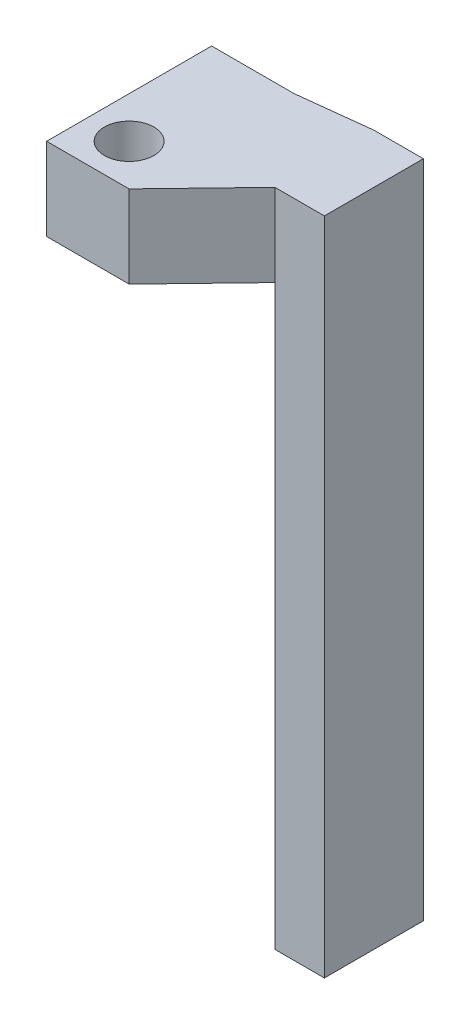
ISO-10303-21;
HEADER;
FILE_DESCRIPTION(('STEP AP214'),'2;1');
FILE_NAME('part.step','',(''),(''),'','','');
FILE_SCHEMA(('AUTOMOTIVE_DESIGN { 1 0 10303 214 1 1 1 1 }'));
ENDSEC;
DATA;
#1=APPLICATION_CONTEXT('core data for automotive mechanical design processes');
#2=APPLICATION_PROTOCOL_DEFINITION('international standard','automotive_design',2000,#1);
#3=PRODUCT_CONTEXT('',#1,'mechanical');
#4=PRODUCT('Part','Part','',(#3));
#5=PRODUCT_RELATED_PRODUCT_CATEGORY('part','',(#4));
#6=PRODUCT_DEFINITION_FORMATION('','',#4);
#7=PRODUCT_DEFINITION_CONTEXT('part definition',#1,'design');
#8=PRODUCT_DEFINITION('design','',#6,#7);
#9=PRODUCT_DEFINITION_SHAPE('','',#8);
#10=(LENGTH_UNIT() NAMED_UNIT(*) SI_UNIT(.MILLI.,.METRE.));
#11=(NAMED_UNIT(*) PLANE_ANGLE_UNIT() SI_UNIT($,.RADIAN.));
#12=(NAMED_UNIT(*) SI_UNIT($,.STERADIAN.) SOLID_ANGLE_UNIT());
#13=UNCERTAINTY_MEASURE_WITH_UNIT(LENGTH_MEASURE(1.E-05),#10,'distance_accuracy_value','');
#14=(GEOMETRIC_REPRESENTATION_CONTEXT(3) GLOBAL_UNCERTAINTY_ASSIGNED_CONTEXT((#13)) GLOBAL_UNIT_ASSIGNED_CONTEXT((#10,
#11,#12)) REPRESENTATION_CONTEXT('',''));
#15=CARTESIAN_POINT('',(0.,0.,0.));
#16=DIRECTION('',(0.,0.,1.));
#17=DIRECTION('',(1.,0.,0.));
#18=AXIS2_PLACEMENT_3D('',#15,#16,#17);
#19=CARTESIAN_POINT('',(0.,-20.,0.));
#20=DIRECTION('',(-1.,0.,0.));
#21=DIRECTION('',(0.,0.,1.));
#22=AXIS2_PLACEMENT_3D('',#19,#20,#21);
#23=PLANE('',#22);
#24=DIRECTION('',(0.,1.,0.));
#25=VECTOR('',#24,1.);
#26=CARTESIAN_POINT('',(0.,-20.,0.));
#27=LINE('',#26,#25);
#28=CARTESIAN_POINT('',(0.,-20.,0.));
#29=VERTEX_POINT('',#28);
#30=CARTESIAN_POINT('',(0.,15.,0.));
#31=VERTEX_POINT('',#30);
#32=EDGE_CURVE('E360',#29,#31,#27,.T.);
#33=ORIENTED_EDGE('',*,*,#32,.T.);
#34=DIRECTION('',(0.,0.,1.));
#35=VECTOR('',#34,1.);
#36=CARTESIAN_POINT('',(0.,15.,-6.));
#37=LINE('',#36,#35);
#38=CARTESIAN_POINT('',(0.,15.,-6.));
#39=VERTEX_POINT('',#38);
#40=EDGE_CURVE('E308',#39,#31,#37,.T.);
#41=ORIENTED_EDGE('',*,*,#40,.F.);
#42=DIRECTION('',(0.,1.,0.));
#43=VECTOR('',#42,1.);
#44=CARTESIAN_POINT('',(0.,-20.,-6.));
#45=LINE('',#44,#43);
#46=CARTESIAN_POINT('',(0.,-20.,-6.));
#47=VERTEX_POINT('',#46);
#48=EDGE_CURVE('E13',#47,#39,#45,.T.);
#49=ORIENTED_EDGE('',*,*,#48,.F.);
#50=DIRECTION('',(0.,0.,1.));
#51=VECTOR('',#50,1.);
#52=CARTESIAN_POINT('',(0.,-20.,0.));
#53=LINE('',#52,#51);
#54=EDGE_CURVE('E305',#47,#29,#53,.T.);
#55=ORIENTED_EDGE('',*,*,#54,.T.);
#56=EDGE_LOOP('',(#33,#41,#49,#55));
#57=FACE_BOUND('',#56,.T.);
#58=ADVANCED_FACE('F91',(#57),#23,.T.);
#59=CARTESIAN_POINT('',(0.,-20.,-6.));
#60=DIRECTION('',(0.,0.,-1.));
#61=DIRECTION('',(-1.,0.,0.));
#62=AXIS2_PLACEMENT_3D('',#59,#60,#61);
#63=PLANE('',#62);
#64=ORIENTED_EDGE('',*,*,#48,.T.);
#65=DIRECTION('',(0.,-1.,0.));
#66=VECTOR('',#65,1.);
#67=CARTESIAN_POINT('',(0.,20.,-6.));
#68=LINE('',#67,#66);
#69=CARTESIAN_POINT('',(0.,20.,-6.));
#70=VERTEX_POINT('',#69);
#71=EDGE_CURVE('E198',#70,#39,#68,.T.);
#72=ORIENTED_EDGE('',*,*,#71,.F.);
#73=DIRECTION('',(-1.,0.,0.));
#74=VECTOR('',#73,1.);
#75=CARTESIAN_POINT('',(0.,20.,-6.));
#76=LINE('',#75,#74);
#77=CARTESIAN_POINT('',(3.,20.,-6.));
#78=VERTEX_POINT('',#77);
#79=EDGE_CURVE('E297',#78,#70,#76,.T.);
#80=ORIENTED_EDGE('',*,*,#79,.F.);
#81=DIRECTION('',(0.,1.,0.));
#82=VECTOR('',#81,1.);
#83=CARTESIAN_POINT('',(3.,-20.,-6.));
#84=LINE('',#83,#82);
#85=CARTESIAN_POINT('',(3.,-20.,-6.));
#86=VERTEX_POINT('',#85);
#87=EDGE_CURVE('E99',#86,#78,#84,.T.);
#88=ORIENTED_EDGE('',*,*,#87,.F.);
#89=DIRECTION('',(-1.,0.,0.));
#90=VECTOR('',#89,1.);
#91=CARTESIAN_POINT('',(0.,-20.,-6.));
#92=LINE('',#91,#90);
#93=EDGE_CURVE('E358',#86,#47,#92,.T.);
#94=ORIENTED_EDGE('',*,*,#93,.T.);
#95=EDGE_LOOP('',(#64,#72,#80,#88,#94));
#96=FACE_BOUND('',#95,.T.);
#97=ADVANCED_FACE('F376',(#96),#63,.T.);
#98=CARTESIAN_POINT('',(3.,-20.,0.));
#99=DIRECTION('',(1.,0.,0.));
#100=DIRECTION('',(0.,0.,-1.));
#101=AXIS2_PLACEMENT_3D('',#98,#99,#100);
#102=PLANE('',#101);
#103=ORIENTED_EDGE('',*,*,#87,.T.);
#104=DIRECTION('',(0.,0.,-1.));
#105=VECTOR('',#104,1.);
#106=CARTESIAN_POINT('',(3.,20.,0.));
#107=LINE('',#106,#105);
#108=CARTESIAN_POINT('',(3.,20.,0.));
#109=VERTEX_POINT('',#108);
#110=EDGE_CURVE('E295',#109,#78,#107,.T.);
#111=ORIENTED_EDGE('',*,*,#110,.F.);
#112=DIRECTION('',(0.,1.,0.));
#113=VECTOR('',#112,1.);
#114=CARTESIAN_POINT('',(3.,-20.,0.));
#115=LINE('',#114,#113);
#116=CARTESIAN_POINT('',(3.,-20.,0.));
#117=VERTEX_POINT('',#116);
#118=EDGE_CURVE('E294',#117,#109,#115,.T.);
#119=ORIENTED_EDGE('',*,*,#118,.F.);
#120=DIRECTION('',(0.,0.,-1.));
#121=VECTOR('',#120,1.);
#122=CARTESIAN_POINT('',(3.,-20.,0.));
#123=LINE('',#122,#121);
#124=EDGE_CURVE('E355',#117,#86,#123,.T.);
#125=ORIENTED_EDGE('',*,*,#124,.T.);
#126=EDGE_LOOP('',(#103,#111,#119,#125));
#127=FACE_BOUND('',#126,.T.);
#128=ADVANCED_FACE('F372',(#127),#102,.T.);
#129=CARTESIAN_POINT('',(0.,-20.,0.));
#130=DIRECTION('',(0.,0.,1.));
#131=DIRECTION('',(1.,0.,0.));
#132=AXIS2_PLACEMENT_3D('',#129,#130,#131);
#133=PLANE('',#132);
#134=ORIENTED_EDGE('',*,*,#118,.T.);
#135=DIRECTION('',(1.,0.,0.));
#136=VECTOR('',#135,1.);
#137=CARTESIAN_POINT('',(0.,20.,0.));
#138=LINE('',#137,#136);
#139=CARTESIAN_POINT('',(0.,20.,0.));
#140=VERTEX_POINT('',#139);
#141=EDGE_CURVE('E244',#140,#109,#138,.T.);
#142=ORIENTED_EDGE('',*,*,#141,.F.);
#143=DIRECTION('',(0.,1.,0.));
#144=VECTOR('',#143,1.);
#145=CARTESIAN_POINT('',(0.,20.,0.));
#146=LINE('',#145,#144);
#147=EDGE_CURVE('E212',#31,#140,#146,.T.);
#148=ORIENTED_EDGE('',*,*,#147,.F.);
#149=ORIENTED_EDGE('',*,*,#32,.F.);
#150=DIRECTION('',(1.,0.,0.));
#151=VECTOR('',#150,1.);
#152=CARTESIAN_POINT('',(0.,-20.,0.));
#153=LINE('',#152,#151);
#154=EDGE_CURVE('E353',#29,#117,#153,.T.);
#155=ORIENTED_EDGE('',*,*,#154,.T.);
#156=EDGE_LOOP('',(#134,#142,#148,#149,#155));
#157=FACE_BOUND('',#156,.T.);
#158=ADVANCED_FACE('F291',(#157),#133,.T.);
#159=CARTESIAN_POINT('',(0.,-20.,0.));
#160=DIRECTION('',(0.,-1.,0.));
#161=DIRECTION('',(0.,0.,-1.));
#162=AXIS2_PLACEMENT_3D('',#159,#160,#161);
#163=PLANE('',#162);
#164=ORIENTED_EDGE('',*,*,#54,.F.);
#165=ORIENTED_EDGE('',*,*,#93,.F.);
#166=ORIENTED_EDGE('',*,*,#124,.F.);
#167=ORIENTED_EDGE('',*,*,#154,.F.);
#168=EDGE_LOOP('',(#164,#165,#166,#167));
#169=FACE_BOUND('',#168,.T.);
#170=ADVANCED_FACE('F369',(#169),#163,.T.);
#171=CARTESIAN_POINT('',(0.,20.,0.));
#172=DIRECTION('',(0.,-1.,0.));
#173=DIRECTION('',(0.,0.,-1.));
#174=AXIS2_PLACEMENT_3D('',#171,#172,#173);
#175=PLANE('',#174);
#176=ORIENTED_EDGE('',*,*,#79,.T.);
#177=CARTESIAN_POINT('',(0.,20.,-6.));
#178=CARTESIAN_POINT('',(-1.44444444444444,20.,-5.83333333333333));
#179=CARTESIAN_POINT('',(-2.88888888888888,20.,-5.66666666666667));
#180=CARTESIAN_POINT('',(-4.33333333333333,20.,-5.5));
#181=B_SPLINE_CURVE_WITH_KNOTS('',3,(#177,#178,#179,#180),.UNSPECIFIED.,.F.,.F.,(4,4),(0.,1.),.UNSPECIFIED.);
#182=CARTESIAN_POINT('',(-4.33333333333333,20.,-5.5));
#183=VERTEX_POINT('',#182);
#184=EDGE_CURVE('E185',#70,#183,#181,.T.);
#185=ORIENTED_EDGE('',*,*,#184,.T.);
#186=DIRECTION('',(1.,0.,0.));
#187=VECTOR('',#186,1.);
#188=CARTESIAN_POINT('',(-9.33333333333333,20.,-5.5));
#189=LINE('',#188,#187);
#190=CARTESIAN_POINT('',(-9.33333333333333,20.,-5.5));
#191=VERTEX_POINT('',#190);
#192=EDGE_CURVE('E167',#191,#183,#189,.T.);
#193=ORIENTED_EDGE('',*,*,#192,.F.);
#194=DIRECTION('',(0.,0.,-1.));
#195=VECTOR('',#194,1.);
#196=CARTESIAN_POINT('',(-9.33333333333333,20.,-5.5));
#197=LINE('',#196,#195);
#198=CARTESIAN_POINT('',(-9.33333333333332,20.,4.5));
#199=VERTEX_POINT('',#198);
#200=EDGE_CURVE('E183',#199,#191,#197,.T.);
#201=ORIENTED_EDGE('',*,*,#200,.F.);
#202=DIRECTION('',(-1.,0.,0.));
#203=VECTOR('',#202,1.);
#204=CARTESIAN_POINT('',(-9.33333333333332,20.,4.5));
#205=LINE('',#204,#203);
#206=CARTESIAN_POINT('',(-4.33333333333333,20.,4.5));
#207=VERTEX_POINT('',#206);
#208=EDGE_CURVE('E174',#207,#199,#205,.T.);
#209=ORIENTED_EDGE('',*,*,#208,.F.);
#210=CARTESIAN_POINT('',(0.,20.,0.));
#211=CARTESIAN_POINT('',(-1.44444444444444,20.,1.5));
#212=CARTESIAN_POINT('',(-2.88888888888889,20.,3.));
#213=CARTESIAN_POINT('',(-4.33333333333333,20.,4.5));
#214=B_SPLINE_CURVE_WITH_KNOTS('',3,(#210,#211,#212,#213),.UNSPECIFIED.,.F.,.F.,(4,4),(0.,1.),.UNSPECIFIED.);
#215=EDGE_CURVE('E200',#140,#207,#214,.T.);
#216=ORIENTED_EDGE('',*,*,#215,.F.);
#217=ORIENTED_EDGE('',*,*,#141,.T.);
#218=ORIENTED_EDGE('',*,*,#110,.T.);
#219=EDGE_LOOP('',(#176,#185,#193,#201,#209,#216,#217,#218));
#220=FACE_BOUND('',#219,.T.);
#221=CARTESIAN_POINT('',(-6.83333333333333,20.,2.));
#222=DIRECTION('',(0.,-1.,0.));
#223=DIRECTION('',(0.,0.,-1.));
#224=AXIS2_PLACEMENT_3D('',#221,#222,#223);
#225=CIRCLE('',#224,1.5);
#226=CARTESIAN_POINT('',(-6.83333333333333,20.,0.499999999999999));
#227=VERTEX_POINT('',#226);
#228=EDGE_CURVE('E197',#227,#227,#225,.T.);
#229=ORIENTED_EDGE('',*,*,#228,.T.);
#230=EDGE_LOOP('',(#229));
#231=FACE_BOUND('',#230,.T.);
#232=ADVANCED_FACE('F180',(#220,#231),#175,.F.);
#233=CARTESIAN_POINT('',(0.,15.,0.));
#234=DIRECTION('',(0.720320213491481,0.,0.69364168706587));
#235=DIRECTION('',(0.,1.,0.));
#236=AXIS2_PLACEMENT_3D('',#233,#234,#235);
#237=PLANE('',#236);
#238=ORIENTED_EDGE('',*,*,#147,.T.);
#239=ORIENTED_EDGE('',*,*,#215,.T.);
#240=DIRECTION('',(0.,-1.,0.));
#241=VECTOR('',#240,1.);
#242=CARTESIAN_POINT('',(-4.33333333333333,20.,4.5));
#243=LINE('',#242,#241);
#244=CARTESIAN_POINT('',(-4.33333333333333,15.,4.5));
#245=VERTEX_POINT('',#244);
#246=EDGE_CURVE('E241',#207,#245,#243,.T.);
#247=ORIENTED_EDGE('',*,*,#246,.T.);
#248=CARTESIAN_POINT('',(0.,15.,0.));
#249=CARTESIAN_POINT('',(-1.44444444444444,15.,1.5));
#250=CARTESIAN_POINT('',(-2.88888888888889,15.,3.));
#251=CARTESIAN_POINT('',(-4.33333333333333,15.,4.5));
#252=B_SPLINE_CURVE_WITH_KNOTS('',3,(#248,#249,#250,#251),.UNSPECIFIED.,.F.,.F.,(4,4),(0.,1.),.UNSPECIFIED.);
#253=EDGE_CURVE('E203',#31,#245,#252,.T.);
#254=ORIENTED_EDGE('',*,*,#253,.F.);
#255=EDGE_LOOP('',(#238,#239,#247,#254));
#256=FACE_BOUND('',#255,.T.);
#257=ADVANCED_FACE('F322',(#256),#237,.T.);
#258=CARTESIAN_POINT('',(0.,15.,-6.));
#259=DIRECTION('',(0.,-1.,0.));
#260=DIRECTION('',(0.,0.,1.));
#261=AXIS2_PLACEMENT_3D('',#258,#259,#260);
#262=PLANE('',#261);
#263=ORIENTED_EDGE('',*,*,#40,.T.);
#264=ORIENTED_EDGE('',*,*,#253,.T.);
#265=DIRECTION('',(-1.,0.,0.));
#266=VECTOR('',#265,1.);
#267=CARTESIAN_POINT('',(-9.33333333333332,15.,4.5));
#268=LINE('',#267,#266);
#269=CARTESIAN_POINT('',(-9.33333333333332,15.,4.5));
#270=VERTEX_POINT('',#269);
#271=EDGE_CURVE('E188',#245,#270,#268,.T.);
#272=ORIENTED_EDGE('',*,*,#271,.T.);
#273=DIRECTION('',(0.,0.,-1.));
#274=VECTOR('',#273,1.);
#275=CARTESIAN_POINT('',(-9.33333333333333,15.,-5.5));
#276=LINE('',#275,#274);
#277=CARTESIAN_POINT('',(-9.33333333333333,15.,-5.5));
#278=VERTEX_POINT('',#277);
#279=EDGE_CURVE('E195',#270,#278,#276,.T.);
#280=ORIENTED_EDGE('',*,*,#279,.T.);
#281=DIRECTION('',(1.,0.,0.));
#282=VECTOR('',#281,1.);
#283=CARTESIAN_POINT('',(-9.33333333333333,15.,-5.5));
#284=LINE('',#283,#282);
#285=CARTESIAN_POINT('',(-4.33333333333333,15.,-5.5));
#286=VERTEX_POINT('',#285);
#287=EDGE_CURVE('E168',#278,#286,#284,.T.);
#288=ORIENTED_EDGE('',*,*,#287,.T.);
#289=CARTESIAN_POINT('',(0.,15.,-6.));
#290=CARTESIAN_POINT('',(-1.44444444444444,15.,-5.83333333333333));
#291=CARTESIAN_POINT('',(-2.88888888888888,15.,-5.66666666666667));
#292=CARTESIAN_POINT('',(-4.33333333333333,15.,-5.5));
#293=B_SPLINE_CURVE_WITH_KNOTS('',3,(#289,#290,#291,#292),.UNSPECIFIED.,.F.,.F.,(4,4),(0.,1.),.UNSPECIFIED.);
#294=EDGE_CURVE('E107',#39,#286,#293,.T.);
#295=ORIENTED_EDGE('',*,*,#294,.F.);
#296=EDGE_LOOP('',(#263,#264,#272,#280,#288,#295));
#297=FACE_BOUND('',#296,.T.);
#298=CARTESIAN_POINT('',(-6.83333333333333,15.,2.));
#299=DIRECTION('',(0.,-1.,0.));
#300=DIRECTION('',(0.,0.,-1.));
#301=AXIS2_PLACEMENT_3D('',#298,#299,#300);
#302=CIRCLE('',#301,1.5);
#303=CARTESIAN_POINT('',(-6.83333333333333,15.,0.499999999999999));
#304=VERTEX_POINT('',#303);
#305=EDGE_CURVE('E193',#304,#304,#302,.T.);
#306=ORIENTED_EDGE('',*,*,#305,.F.);
#307=EDGE_LOOP('',(#306));
#308=FACE_BOUND('',#307,.T.);
#309=ADVANCED_FACE('F319',(#297,#308),#262,.T.);
#310=CARTESIAN_POINT('',(0.,20.,-6.));
#311=DIRECTION('',(-0.114624107985131,0.,-0.993408935871131));
#312=DIRECTION('',(0.,-1.,0.));
#313=AXIS2_PLACEMENT_3D('',#310,#311,#312);
#314=PLANE('',#313);
#315=ORIENTED_EDGE('',*,*,#71,.T.);
#316=ORIENTED_EDGE('',*,*,#294,.T.);
#317=DIRECTION('',(0.,-1.,0.));
#318=VECTOR('',#317,1.);
#319=CARTESIAN_POINT('',(-4.33333333333333,20.,-5.5));
#320=LINE('',#319,#318);
#321=EDGE_CURVE('E202',#183,#286,#320,.T.);
#322=ORIENTED_EDGE('',*,*,#321,.F.);
#323=ORIENTED_EDGE('',*,*,#184,.F.);
#324=EDGE_LOOP('',(#315,#316,#322,#323));
#325=FACE_BOUND('',#324,.T.);
#326=ADVANCED_FACE('F338',(#325),#314,.T.);
#327=CARTESIAN_POINT('',(-9.33333333333333,20.,-5.5));
#328=DIRECTION('',(-1.,0.,0.));
#329=DIRECTION('',(0.,0.,1.));
#330=AXIS2_PLACEMENT_3D('',#327,#328,#329);
#331=PLANE('',#330);
#332=ORIENTED_EDGE('',*,*,#279,.F.);
#333=DIRECTION('',(0.,-1.,0.));
#334=VECTOR('',#333,1.);
#335=CARTESIAN_POINT('',(-9.33333333333332,20.,4.5));
#336=LINE('',#335,#334);
#337=EDGE_CURVE('E173',#199,#270,#336,.T.);
#338=ORIENTED_EDGE('',*,*,#337,.F.);
#339=ORIENTED_EDGE('',*,*,#200,.T.);
#340=DIRECTION('',(0.,-1.,0.));
#341=VECTOR('',#340,1.);
#342=CARTESIAN_POINT('',(-9.33333333333333,20.,-5.5));
#343=LINE('',#342,#341);
#344=EDGE_CURVE('E163',#191,#278,#343,.T.);
#345=ORIENTED_EDGE('',*,*,#344,.T.);
#346=EDGE_LOOP('',(#332,#338,#339,#345));
#347=FACE_BOUND('',#346,.T.);
#348=ADVANCED_FACE('F187',(#347),#331,.T.);
#349=CARTESIAN_POINT('',(-9.33333333333332,20.,4.5));
#350=DIRECTION('',(0.,0.,1.));
#351=DIRECTION('',(1.,0.,0.));
#352=AXIS2_PLACEMENT_3D('',#349,#350,#351);
#353=PLANE('',#352);
#354=ORIENTED_EDGE('',*,*,#271,.F.);
#355=ORIENTED_EDGE('',*,*,#246,.F.);
#356=ORIENTED_EDGE('',*,*,#208,.T.);
#357=ORIENTED_EDGE('',*,*,#337,.T.);
#358=EDGE_LOOP('',(#354,#355,#356,#357));
#359=FACE_BOUND('',#358,.T.);
#360=ADVANCED_FACE('F251',(#359),#353,.T.);
#361=CARTESIAN_POINT('',(-9.33333333333333,20.,-5.5));
#362=DIRECTION('',(0.,0.,-1.));
#363=DIRECTION('',(-1.,0.,0.));
#364=AXIS2_PLACEMENT_3D('',#361,#362,#363);
#365=PLANE('',#364);
#366=ORIENTED_EDGE('',*,*,#287,.F.);
#367=ORIENTED_EDGE('',*,*,#344,.F.);
#368=ORIENTED_EDGE('',*,*,#192,.T.);
#369=ORIENTED_EDGE('',*,*,#321,.T.);
#370=EDGE_LOOP('',(#366,#367,#368,#369));
#371=FACE_BOUND('',#370,.T.);
#372=ADVANCED_FACE('F165',(#371),#365,.T.);
#373=CARTESIAN_POINT('',(-6.83333333333333,20.,2.));
#374=DIRECTION('',(0.,-1.,0.));
#375=DIRECTION('',(0.,0.,-1.));
#376=AXIS2_PLACEMENT_3D('',#373,#374,#375);
#377=CYLINDRICAL_SURFACE('',#376,1.5);
#378=ORIENTED_EDGE('',*,*,#228,.F.);
#379=EDGE_LOOP('',(#378));
#380=FACE_BOUND('',#379,.T.);
#381=ORIENTED_EDGE('',*,*,#305,.T.);
#382=EDGE_LOOP('',(#381));
#383=FACE_BOUND('',#382,.T.);
#384=ADVANCED_FACE('F262',(#380,#383),#377,.F.);
#385=CLOSED_SHELL('',(#58,#97,#128,#158,#170,#232,#257,#309,#326,#348,#360,#372,#384));
#386=MANIFOLD_SOLID_BREP('B2',#385);
#387=ADVANCED_BREP_SHAPE_REPRESENTATION('',(#18,#386),#14);
#388=SHAPE_DEFINITION_REPRESENTATION(#9,#387);
ENDSEC;
END-ISO-10303-21;
